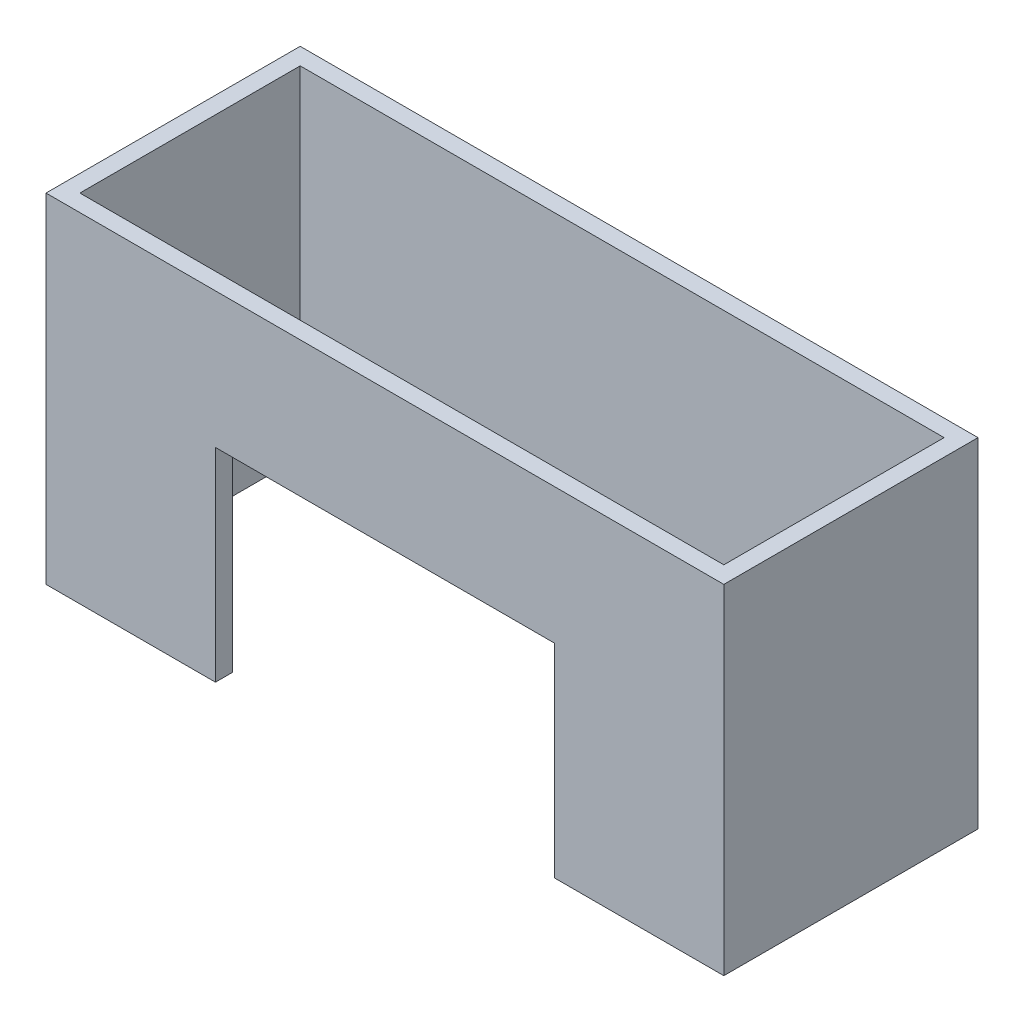
ISO-10303-21;
HEADER;
FILE_DESCRIPTION(('STEP AP214'),'2;1');
FILE_NAME('part.step','',(''),(''),'','','');
FILE_SCHEMA(('AUTOMOTIVE_DESIGN { 1 0 10303 214 1 1 1 1 }'));
ENDSEC;
DATA;
#1=APPLICATION_CONTEXT('core data for automotive mechanical design processes');
#2=APPLICATION_PROTOCOL_DEFINITION('international standard','automotive_design',2000,#1);
#3=PRODUCT_CONTEXT('',#1,'mechanical');
#4=PRODUCT('Part','Part','',(#3));
#5=PRODUCT_RELATED_PRODUCT_CATEGORY('part','',(#4));
#6=PRODUCT_DEFINITION_FORMATION('','',#4);
#7=PRODUCT_DEFINITION_CONTEXT('part definition',#1,'design');
#8=PRODUCT_DEFINITION('design','',#6,#7);
#9=PRODUCT_DEFINITION_SHAPE('','',#8);
#10=(LENGTH_UNIT() NAMED_UNIT(*) SI_UNIT(.MILLI.,.METRE.));
#11=(NAMED_UNIT(*) PLANE_ANGLE_UNIT() SI_UNIT($,.RADIAN.));
#12=(NAMED_UNIT(*) SI_UNIT($,.STERADIAN.) SOLID_ANGLE_UNIT());
#13=UNCERTAINTY_MEASURE_WITH_UNIT(LENGTH_MEASURE(1.E-05),#10,'distance_accuracy_value','');
#14=(GEOMETRIC_REPRESENTATION_CONTEXT(3) GLOBAL_UNCERTAINTY_ASSIGNED_CONTEXT((#13)) GLOBAL_UNIT_ASSIGNED_CONTEXT((#10,
#11,#12)) REPRESENTATION_CONTEXT('',''));
#15=CARTESIAN_POINT('',(0.,0.,0.));
#16=DIRECTION('',(0.,0.,1.));
#17=DIRECTION('',(1.,0.,0.));
#18=AXIS2_PLACEMENT_3D('',#15,#16,#17);
#19=CARTESIAN_POINT('',(0.,0.,150.));
#20=DIRECTION('',(-1.,0.,0.));
#21=DIRECTION('',(0.,0.,1.));
#22=AXIS2_PLACEMENT_3D('',#19,#20,#21);
#23=PLANE('',#22);
#24=DIRECTION('',(0.,1.,0.));
#25=VECTOR('',#24,1.);
#26=CARTESIAN_POINT('',(0.,0.,0.));
#27=LINE('',#26,#25);
#28=CARTESIAN_POINT('',(0.,0.,0.));
#29=VERTEX_POINT('',#28);
#30=CARTESIAN_POINT('',(0.,200.,0.));
#31=VERTEX_POINT('',#30);
#32=EDGE_CURVE('E203',#29,#31,#27,.T.);
#33=ORIENTED_EDGE('',*,*,#32,.T.);
#34=DIRECTION('',(0.,0.,-1.));
#35=VECTOR('',#34,1.);
#36=CARTESIAN_POINT('',(0.,200.,150.));
#37=LINE('',#36,#35);
#38=CARTESIAN_POINT('',(0.,200.,150.));
#39=VERTEX_POINT('',#38);
#40=EDGE_CURVE('E49',#39,#31,#37,.T.);
#41=ORIENTED_EDGE('',*,*,#40,.F.);
#42=DIRECTION('',(0.,1.,0.));
#43=VECTOR('',#42,1.);
#44=CARTESIAN_POINT('',(0.,0.,150.));
#45=LINE('',#44,#43);
#46=CARTESIAN_POINT('',(0.,0.,150.));
#47=VERTEX_POINT('',#46);
#48=EDGE_CURVE('E212',#47,#39,#45,.T.);
#49=ORIENTED_EDGE('',*,*,#48,.F.);
#50=DIRECTION('',(0.,0.,-1.));
#51=VECTOR('',#50,1.);
#52=CARTESIAN_POINT('',(0.,0.,150.));
#53=LINE('',#52,#51);
#54=EDGE_CURVE('E228',#47,#29,#53,.T.);
#55=ORIENTED_EDGE('',*,*,#54,.T.);
#56=EDGE_LOOP('',(#33,#41,#49,#55));
#57=FACE_BOUND('',#56,.T.);
#58=ADVANCED_FACE('F41',(#57),#23,.F.);
#59=CARTESIAN_POINT('',(0.,200.,150.));
#60=DIRECTION('',(0.,-1.,0.));
#61=DIRECTION('',(1.,0.,0.));
#62=AXIS2_PLACEMENT_3D('',#59,#60,#61);
#63=PLANE('',#62);
#64=DIRECTION('',(-1.,0.,0.));
#65=VECTOR('',#64,1.);
#66=CARTESIAN_POINT('',(-10.0000000000001,200.,10.0000000000001));
#67=LINE('',#66,#65);
#68=CARTESIAN_POINT('',(-10.0000000000001,200.,10.0000000000001));
#69=VERTEX_POINT('',#68);
#70=CARTESIAN_POINT('',(-390.,200.,10.));
#71=VERTEX_POINT('',#70);
#72=EDGE_CURVE('E165',#69,#71,#67,.T.);
#73=ORIENTED_EDGE('',*,*,#72,.F.);
#74=DIRECTION('',(0.,0.,-1.));
#75=VECTOR('',#74,1.);
#76=CARTESIAN_POINT('',(-10.0000000000001,200.,10.0000000000001));
#77=LINE('',#76,#75);
#78=CARTESIAN_POINT('',(-10.0000000000001,200.,140.));
#79=VERTEX_POINT('',#78);
#80=EDGE_CURVE('E56',#79,#69,#77,.T.);
#81=ORIENTED_EDGE('',*,*,#80,.F.);
#82=DIRECTION('',(1.,0.,0.));
#83=VECTOR('',#82,1.);
#84=CARTESIAN_POINT('',(-10.0000000000001,200.,140.));
#85=LINE('',#84,#83);
#86=CARTESIAN_POINT('',(-390.,200.,140.));
#87=VERTEX_POINT('',#86);
#88=EDGE_CURVE('E151',#87,#79,#85,.T.);
#89=ORIENTED_EDGE('',*,*,#88,.F.);
#90=DIRECTION('',(0.,0.,1.));
#91=VECTOR('',#90,1.);
#92=CARTESIAN_POINT('',(-390.,200.,10.));
#93=LINE('',#92,#91);
#94=EDGE_CURVE('E155',#71,#87,#93,.T.);
#95=ORIENTED_EDGE('',*,*,#94,.F.);
#96=EDGE_LOOP('',(#73,#81,#89,#95));
#97=FACE_BOUND('',#96,.T.);
#98=DIRECTION('',(-1.,0.,0.));
#99=VECTOR('',#98,1.);
#100=CARTESIAN_POINT('',(0.,200.,0.));
#101=LINE('',#100,#99);
#102=CARTESIAN_POINT('',(-400.,200.,0.));
#103=VERTEX_POINT('',#102);
#104=EDGE_CURVE('E232',#31,#103,#101,.T.);
#105=ORIENTED_EDGE('',*,*,#104,.T.);
#106=DIRECTION('',(0.,0.,-1.));
#107=VECTOR('',#106,1.);
#108=CARTESIAN_POINT('',(-400.,200.,150.));
#109=LINE('',#108,#107);
#110=CARTESIAN_POINT('',(-400.,200.,150.));
#111=VERTEX_POINT('',#110);
#112=EDGE_CURVE('E247',#111,#103,#109,.T.);
#113=ORIENTED_EDGE('',*,*,#112,.F.);
#114=DIRECTION('',(-1.,0.,0.));
#115=VECTOR('',#114,1.);
#116=CARTESIAN_POINT('',(0.,200.,150.));
#117=LINE('',#116,#115);
#118=EDGE_CURVE('E216',#39,#111,#117,.T.);
#119=ORIENTED_EDGE('',*,*,#118,.F.);
#120=ORIENTED_EDGE('',*,*,#40,.T.);
#121=EDGE_LOOP('',(#105,#113,#119,#120));
#122=FACE_BOUND('',#121,.T.);
#123=ADVANCED_FACE('F254',(#97,#122),#63,.F.);
#124=CARTESIAN_POINT('',(-400.,0.,150.));
#125=DIRECTION('',(1.,0.,0.));
#126=DIRECTION('',(0.,0.,-1.));
#127=AXIS2_PLACEMENT_3D('',#124,#125,#126);
#128=PLANE('',#127);
#129=DIRECTION('',(0.,-1.,0.));
#130=VECTOR('',#129,1.);
#131=CARTESIAN_POINT('',(-400.,0.,0.));
#132=LINE('',#131,#130);
#133=CARTESIAN_POINT('',(-400.,0.,0.));
#134=VERTEX_POINT('',#133);
#135=EDGE_CURVE('E235',#103,#134,#132,.T.);
#136=ORIENTED_EDGE('',*,*,#135,.T.);
#137=DIRECTION('',(0.,0.,-1.));
#138=VECTOR('',#137,1.);
#139=CARTESIAN_POINT('',(-400.,0.,150.));
#140=LINE('',#139,#138);
#141=CARTESIAN_POINT('',(-400.,0.,150.));
#142=VERTEX_POINT('',#141);
#143=EDGE_CURVE('E243',#142,#134,#140,.T.);
#144=ORIENTED_EDGE('',*,*,#143,.F.);
#145=DIRECTION('',(0.,-1.,0.));
#146=VECTOR('',#145,1.);
#147=CARTESIAN_POINT('',(-400.,0.,150.));
#148=LINE('',#147,#146);
#149=EDGE_CURVE('E220',#111,#142,#148,.T.);
#150=ORIENTED_EDGE('',*,*,#149,.F.);
#151=ORIENTED_EDGE('',*,*,#112,.T.);
#152=EDGE_LOOP('',(#136,#144,#150,#151));
#153=FACE_BOUND('',#152,.T.);
#154=ADVANCED_FACE('F266',(#153),#128,.F.);
#155=CARTESIAN_POINT('',(0.,0.,150.));
#156=DIRECTION('',(0.,1.,0.));
#157=DIRECTION('',(-1.,0.,0.));
#158=AXIS2_PLACEMENT_3D('',#155,#156,#157);
#159=PLANE('',#158);
#160=DIRECTION('',(0.,0.,1.));
#161=VECTOR('',#160,1.);
#162=CARTESIAN_POINT('',(-100.,0.,130.));
#163=LINE('',#162,#161);
#164=CARTESIAN_POINT('',(-100.,0.,140.));
#165=VERTEX_POINT('',#164);
#166=CARTESIAN_POINT('',(-100.,0.,150.));
#167=VERTEX_POINT('',#166);
#168=EDGE_CURVE('E207',#165,#167,#163,.T.);
#169=ORIENTED_EDGE('',*,*,#168,.F.);
#170=DIRECTION('',(1.,0.,0.));
#171=VECTOR('',#170,1.);
#172=CARTESIAN_POINT('',(-10.0000000000001,0.,140.));
#173=LINE('',#172,#171);
#174=CARTESIAN_POINT('',(-10.0000000000001,0.,140.));
#175=VERTEX_POINT('',#174);
#176=EDGE_CURVE('E64',#165,#175,#173,.T.);
#177=ORIENTED_EDGE('',*,*,#176,.T.);
#178=DIRECTION('',(0.,0.,-1.));
#179=VECTOR('',#178,1.);
#180=CARTESIAN_POINT('',(-10.0000000000001,0.,10.0000000000001));
#181=LINE('',#180,#179);
#182=CARTESIAN_POINT('',(-10.0000000000001,0.,10.0000000000001));
#183=VERTEX_POINT('',#182);
#184=EDGE_CURVE('E131',#175,#183,#181,.T.);
#185=ORIENTED_EDGE('',*,*,#184,.T.);
#186=DIRECTION('',(-1.,0.,0.));
#187=VECTOR('',#186,1.);
#188=CARTESIAN_POINT('',(-10.0000000000001,0.,10.0000000000001));
#189=LINE('',#188,#187);
#190=CARTESIAN_POINT('',(-390.,0.,10.));
#191=VERTEX_POINT('',#190);
#192=EDGE_CURVE('E140',#183,#191,#189,.T.);
#193=ORIENTED_EDGE('',*,*,#192,.T.);
#194=DIRECTION('',(0.,0.,1.));
#195=VECTOR('',#194,1.);
#196=CARTESIAN_POINT('',(-390.,0.,10.));
#197=LINE('',#196,#195);
#198=CARTESIAN_POINT('',(-390.,0.,140.));
#199=VERTEX_POINT('',#198);
#200=EDGE_CURVE('E146',#191,#199,#197,.T.);
#201=ORIENTED_EDGE('',*,*,#200,.T.);
#202=CARTESIAN_POINT('',(-300.,0.,140.));
#203=VERTEX_POINT('',#202);
#204=EDGE_CURVE('E137',#199,#203,#173,.T.);
#205=ORIENTED_EDGE('',*,*,#204,.T.);
#206=DIRECTION('',(0.,0.,1.));
#207=VECTOR('',#206,1.);
#208=CARTESIAN_POINT('',(-300.,0.,130.));
#209=LINE('',#208,#207);
#210=CARTESIAN_POINT('',(-300.,0.,150.));
#211=VERTEX_POINT('',#210);
#212=EDGE_CURVE('E199',#203,#211,#209,.T.);
#213=ORIENTED_EDGE('',*,*,#212,.T.);
#214=DIRECTION('',(1.,0.,0.));
#215=VECTOR('',#214,1.);
#216=CARTESIAN_POINT('',(0.,0.,150.));
#217=LINE('',#216,#215);
#218=EDGE_CURVE('E224',#142,#211,#217,.T.);
#219=ORIENTED_EDGE('',*,*,#218,.F.);
#220=ORIENTED_EDGE('',*,*,#143,.T.);
#221=DIRECTION('',(1.,0.,0.));
#222=VECTOR('',#221,1.);
#223=CARTESIAN_POINT('',(0.,0.,0.));
#224=LINE('',#223,#222);
#225=EDGE_CURVE('E217',#134,#29,#224,.T.);
#226=ORIENTED_EDGE('',*,*,#225,.T.);
#227=ORIENTED_EDGE('',*,*,#54,.F.);
#228=EDGE_CURVE('E223',#167,#47,#217,.T.);
#229=ORIENTED_EDGE('',*,*,#228,.F.);
#230=EDGE_LOOP('',(#169,#177,#185,#193,#201,#205,#213,#219,#220,#226,#227,#229));
#231=FACE_BOUND('',#230,.T.);
#232=ADVANCED_FACE('F149',(#231),#159,.F.);
#233=CARTESIAN_POINT('',(0.,0.,150.));
#234=DIRECTION('',(0.,0.,1.));
#235=DIRECTION('',(1.,0.,0.));
#236=AXIS2_PLACEMENT_3D('',#233,#234,#235);
#237=PLANE('',#236);
#238=DIRECTION('',(0.,-1.,0.));
#239=VECTOR('',#238,1.);
#240=CARTESIAN_POINT('',(-300.,0.,150.));
#241=LINE('',#240,#239);
#242=CARTESIAN_POINT('',(-300.,120.,150.));
#243=VERTEX_POINT('',#242);
#244=EDGE_CURVE('E187',#243,#211,#241,.T.);
#245=ORIENTED_EDGE('',*,*,#244,.F.);
#246=DIRECTION('',(-1.,0.,0.));
#247=VECTOR('',#246,1.);
#248=CARTESIAN_POINT('',(-300.,120.,150.));
#249=LINE('',#248,#247);
#250=CARTESIAN_POINT('',(-100.,120.,150.));
#251=VERTEX_POINT('',#250);
#252=EDGE_CURVE('E195',#251,#243,#249,.T.);
#253=ORIENTED_EDGE('',*,*,#252,.F.);
#254=DIRECTION('',(0.,1.,0.));
#255=VECTOR('',#254,1.);
#256=CARTESIAN_POINT('',(-100.,0.,150.));
#257=LINE('',#256,#255);
#258=EDGE_CURVE('E191',#167,#251,#257,.T.);
#259=ORIENTED_EDGE('',*,*,#258,.F.);
#260=ORIENTED_EDGE('',*,*,#228,.T.);
#261=ORIENTED_EDGE('',*,*,#48,.T.);
#262=ORIENTED_EDGE('',*,*,#118,.T.);
#263=ORIENTED_EDGE('',*,*,#149,.T.);
#264=ORIENTED_EDGE('',*,*,#218,.T.);
#265=EDGE_LOOP('',(#245,#253,#259,#260,#261,#262,#263,#264));
#266=FACE_BOUND('',#265,.T.);
#267=ADVANCED_FACE('F272',(#266),#237,.T.);
#268=CARTESIAN_POINT('',(0.,0.,0.));
#269=DIRECTION('',(0.,0.,1.));
#270=DIRECTION('',(1.,0.,0.));
#271=AXIS2_PLACEMENT_3D('',#268,#269,#270);
#272=PLANE('',#271);
#273=ORIENTED_EDGE('',*,*,#32,.F.);
#274=ORIENTED_EDGE('',*,*,#225,.F.);
#275=ORIENTED_EDGE('',*,*,#135,.F.);
#276=ORIENTED_EDGE('',*,*,#104,.F.);
#277=EDGE_LOOP('',(#273,#274,#275,#276));
#278=FACE_BOUND('',#277,.T.);
#279=ADVANCED_FACE('F262',(#278),#272,.F.);
#280=CARTESIAN_POINT('',(-300.,0.,130.));
#281=DIRECTION('',(-1.,0.,0.));
#282=DIRECTION('',(0.,0.,1.));
#283=AXIS2_PLACEMENT_3D('',#280,#281,#282);
#284=PLANE('',#283);
#285=ORIENTED_EDGE('',*,*,#212,.F.);
#286=DIRECTION('',(0.,1.,0.));
#287=VECTOR('',#286,1.);
#288=CARTESIAN_POINT('',(-300.,0.,140.));
#289=LINE('',#288,#287);
#290=CARTESIAN_POINT('',(-300.,120.,140.));
#291=VERTEX_POINT('',#290);
#292=EDGE_CURVE('E183',#203,#291,#289,.T.);
#293=ORIENTED_EDGE('',*,*,#292,.T.);
#294=DIRECTION('',(0.,0.,1.));
#295=VECTOR('',#294,1.);
#296=CARTESIAN_POINT('',(-300.,120.,130.));
#297=LINE('',#296,#295);
#298=EDGE_CURVE('E200',#291,#243,#297,.T.);
#299=ORIENTED_EDGE('',*,*,#298,.T.);
#300=ORIENTED_EDGE('',*,*,#244,.T.);
#301=EDGE_LOOP('',(#285,#293,#299,#300));
#302=FACE_BOUND('',#301,.T.);
#303=ADVANCED_FACE('F287',(#302),#284,.F.);
#304=CARTESIAN_POINT('',(-300.,120.,130.));
#305=DIRECTION('',(0.,1.,0.));
#306=DIRECTION('',(0.,0.,1.));
#307=AXIS2_PLACEMENT_3D('',#304,#305,#306);
#308=PLANE('',#307);
#309=ORIENTED_EDGE('',*,*,#298,.F.);
#310=DIRECTION('',(1.,0.,0.));
#311=VECTOR('',#310,1.);
#312=CARTESIAN_POINT('',(-300.,120.,140.));
#313=LINE('',#312,#311);
#314=CARTESIAN_POINT('',(-100.,120.,140.));
#315=VERTEX_POINT('',#314);
#316=EDGE_CURVE('E174',#291,#315,#313,.T.);
#317=ORIENTED_EDGE('',*,*,#316,.T.);
#318=DIRECTION('',(0.,0.,1.));
#319=VECTOR('',#318,1.);
#320=CARTESIAN_POINT('',(-100.,120.,130.));
#321=LINE('',#320,#319);
#322=EDGE_CURVE('E204',#315,#251,#321,.T.);
#323=ORIENTED_EDGE('',*,*,#322,.T.);
#324=ORIENTED_EDGE('',*,*,#252,.T.);
#325=EDGE_LOOP('',(#309,#317,#323,#324));
#326=FACE_BOUND('',#325,.T.);
#327=ADVANCED_FACE('F285',(#326),#308,.F.);
#328=CARTESIAN_POINT('',(-100.,0.,130.));
#329=DIRECTION('',(1.,0.,0.));
#330=DIRECTION('',(0.,0.,-1.));
#331=AXIS2_PLACEMENT_3D('',#328,#329,#330);
#332=PLANE('',#331);
#333=ORIENTED_EDGE('',*,*,#322,.F.);
#334=DIRECTION('',(0.,-1.,0.));
#335=VECTOR('',#334,1.);
#336=CARTESIAN_POINT('',(-100.,0.,140.));
#337=LINE('',#336,#335);
#338=EDGE_CURVE('E11',#315,#165,#337,.T.);
#339=ORIENTED_EDGE('',*,*,#338,.T.);
#340=ORIENTED_EDGE('',*,*,#168,.T.);
#341=ORIENTED_EDGE('',*,*,#258,.T.);
#342=EDGE_LOOP('',(#333,#339,#340,#341));
#343=FACE_BOUND('',#342,.T.);
#344=ADVANCED_FACE('F280',(#343),#332,.F.);
#345=CARTESIAN_POINT('',(-10.0000000000001,0.,140.));
#346=DIRECTION('',(0.,0.,1.));
#347=DIRECTION('',(1.,0.,0.));
#348=AXIS2_PLACEMENT_3D('',#345,#346,#347);
#349=PLANE('',#348);
#350=ORIENTED_EDGE('',*,*,#204,.F.);
#351=DIRECTION('',(0.,1.,0.));
#352=VECTOR('',#351,1.);
#353=CARTESIAN_POINT('',(-390.,0.,140.));
#354=LINE('',#353,#352);
#355=EDGE_CURVE('E175',#199,#87,#354,.T.);
#356=ORIENTED_EDGE('',*,*,#355,.T.);
#357=ORIENTED_EDGE('',*,*,#88,.T.);
#358=DIRECTION('',(0.,1.,0.));
#359=VECTOR('',#358,1.);
#360=CARTESIAN_POINT('',(-10.0000000000001,0.,140.));
#361=LINE('',#360,#359);
#362=EDGE_CURVE('E171',#175,#79,#361,.T.);
#363=ORIENTED_EDGE('',*,*,#362,.F.);
#364=ORIENTED_EDGE('',*,*,#176,.F.);
#365=ORIENTED_EDGE('',*,*,#338,.F.);
#366=ORIENTED_EDGE('',*,*,#316,.F.);
#367=ORIENTED_EDGE('',*,*,#292,.F.);
#368=EDGE_LOOP('',(#350,#356,#357,#363,#364,#365,#366,#367));
#369=FACE_BOUND('',#368,.T.);
#370=ADVANCED_FACE('F282',(#369),#349,.F.);
#371=CARTESIAN_POINT('',(-10.0000000000001,0.,10.0000000000001));
#372=DIRECTION('',(1.,0.,0.));
#373=DIRECTION('',(0.,1.,0.));
#374=AXIS2_PLACEMENT_3D('',#371,#372,#373);
#375=PLANE('',#374);
#376=ORIENTED_EDGE('',*,*,#80,.T.);
#377=DIRECTION('',(0.,1.,0.));
#378=VECTOR('',#377,1.);
#379=CARTESIAN_POINT('',(-10.0000000000001,0.,10.0000000000001));
#380=LINE('',#379,#378);
#381=EDGE_CURVE('E127',#183,#69,#380,.T.);
#382=ORIENTED_EDGE('',*,*,#381,.F.);
#383=ORIENTED_EDGE('',*,*,#184,.F.);
#384=ORIENTED_EDGE('',*,*,#362,.T.);
#385=EDGE_LOOP('',(#376,#382,#383,#384));
#386=FACE_BOUND('',#385,.T.);
#387=ADVANCED_FACE('F129',(#386),#375,.F.);
#388=CARTESIAN_POINT('',(-390.,0.,10.));
#389=DIRECTION('',(-1.,0.,0.));
#390=DIRECTION('',(0.,-1.,0.));
#391=AXIS2_PLACEMENT_3D('',#388,#389,#390);
#392=PLANE('',#391);
#393=ORIENTED_EDGE('',*,*,#94,.T.);
#394=ORIENTED_EDGE('',*,*,#355,.F.);
#395=ORIENTED_EDGE('',*,*,#200,.F.);
#396=DIRECTION('',(0.,1.,0.));
#397=VECTOR('',#396,1.);
#398=CARTESIAN_POINT('',(-390.,0.,10.));
#399=LINE('',#398,#397);
#400=EDGE_CURVE('E136',#191,#71,#399,.T.);
#401=ORIENTED_EDGE('',*,*,#400,.T.);
#402=EDGE_LOOP('',(#393,#394,#395,#401));
#403=FACE_BOUND('',#402,.T.);
#404=ADVANCED_FACE('F289',(#403),#392,.F.);
#405=CARTESIAN_POINT('',(-10.0000000000001,0.,10.0000000000001));
#406=DIRECTION('',(0.,0.,-1.));
#407=DIRECTION('',(-1.,0.,0.));
#408=AXIS2_PLACEMENT_3D('',#405,#406,#407);
#409=PLANE('',#408);
#410=ORIENTED_EDGE('',*,*,#72,.T.);
#411=ORIENTED_EDGE('',*,*,#400,.F.);
#412=ORIENTED_EDGE('',*,*,#192,.F.);
#413=ORIENTED_EDGE('',*,*,#381,.T.);
#414=EDGE_LOOP('',(#410,#411,#412,#413));
#415=FACE_BOUND('',#414,.T.);
#416=ADVANCED_FACE('F141',(#415),#409,.F.);
#417=CLOSED_SHELL('',(#58,#123,#154,#232,#267,#279,#303,#327,#344,#370,#387,#404,#416));
#418=MANIFOLD_SOLID_BREP('B2',#417);
#419=ADVANCED_BREP_SHAPE_REPRESENTATION('',(#18,#418),#14);
#420=SHAPE_DEFINITION_REPRESENTATION(#9,#419);
ENDSEC;
END-ISO-10303-21;
